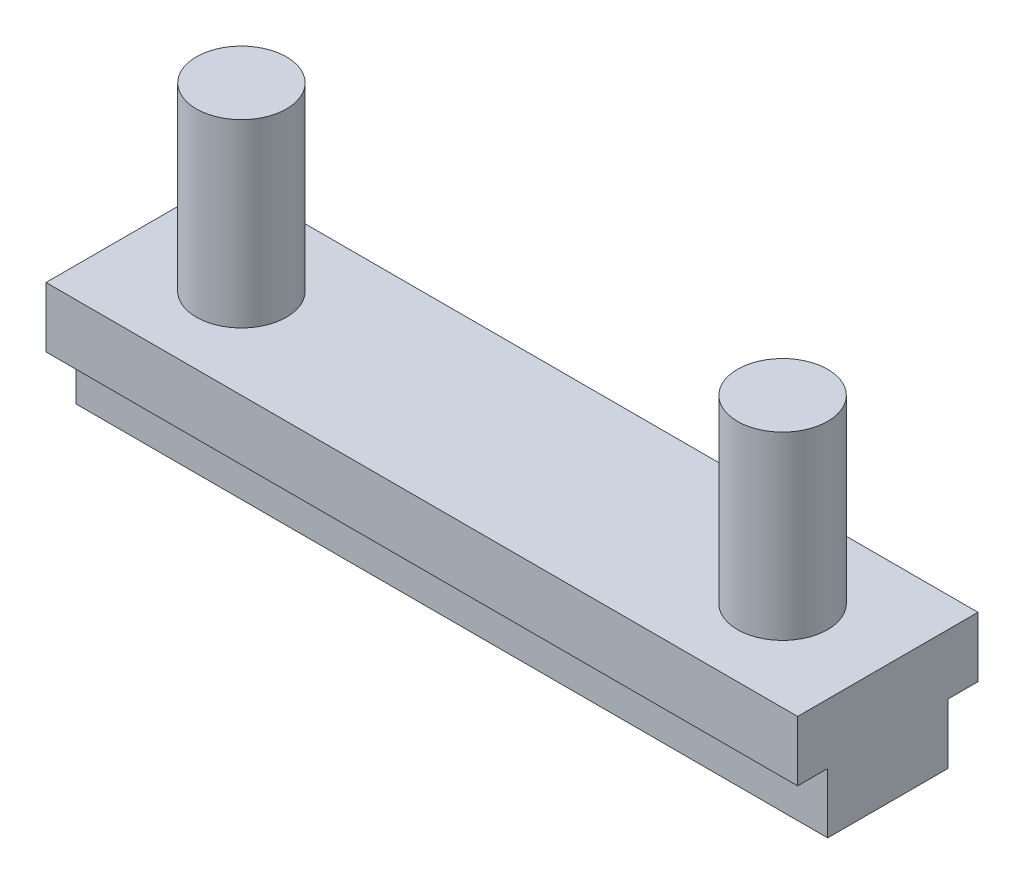
ISO-10303-21;
HEADER;
FILE_DESCRIPTION(('STEP AP214'),'2;1');
FILE_NAME('part.step','',(''),(''),'','','');
FILE_SCHEMA(('AUTOMOTIVE_DESIGN { 1 0 10303 214 1 1 1 1 }'));
ENDSEC;
DATA;
#1=APPLICATION_CONTEXT('core data for automotive mechanical design processes');
#2=APPLICATION_PROTOCOL_DEFINITION('international standard','automotive_design',2000,#1);
#3=PRODUCT_CONTEXT('',#1,'mechanical');
#4=PRODUCT('Part','Part','',(#3));
#5=PRODUCT_RELATED_PRODUCT_CATEGORY('part','',(#4));
#6=PRODUCT_DEFINITION_FORMATION('','',#4);
#7=PRODUCT_DEFINITION_CONTEXT('part definition',#1,'design');
#8=PRODUCT_DEFINITION('design','',#6,#7);
#9=PRODUCT_DEFINITION_SHAPE('','',#8);
#10=(LENGTH_UNIT() NAMED_UNIT(*) SI_UNIT(.MILLI.,.METRE.));
#11=(NAMED_UNIT(*) PLANE_ANGLE_UNIT() SI_UNIT($,.RADIAN.));
#12=(NAMED_UNIT(*) SI_UNIT($,.STERADIAN.) SOLID_ANGLE_UNIT());
#13=UNCERTAINTY_MEASURE_WITH_UNIT(LENGTH_MEASURE(1.E-05),#10,'distance_accuracy_value','');
#14=(GEOMETRIC_REPRESENTATION_CONTEXT(3) GLOBAL_UNCERTAINTY_ASSIGNED_CONTEXT((#13)) GLOBAL_UNIT_ASSIGNED_CONTEXT((#10,
#11,#12)) REPRESENTATION_CONTEXT('',''));
#15=CARTESIAN_POINT('',(0.,0.,0.));
#16=DIRECTION('',(0.,0.,1.));
#17=DIRECTION('',(1.,0.,0.));
#18=AXIS2_PLACEMENT_3D('',#15,#16,#17);
#19=CARTESIAN_POINT('',(0.,0.,0.));
#20=DIRECTION('',(0.,-1.,0.));
#21=DIRECTION('',(0.,0.,-1.));
#22=AXIS2_PLACEMENT_3D('',#19,#20,#21);
#23=PLANE('',#22);
#24=DIRECTION('',(1.,0.,0.));
#25=VECTOR('',#24,1.);
#26=CARTESIAN_POINT('',(-62.5,0.,-10.));
#27=LINE('',#26,#25);
#28=CARTESIAN_POINT('',(-62.5,0.,-10.));
#29=VERTEX_POINT('',#28);
#30=CARTESIAN_POINT('',(62.5,0.,-10.));
#31=VERTEX_POINT('',#30);
#32=EDGE_CURVE('E61',#29,#31,#27,.T.);
#33=ORIENTED_EDGE('',*,*,#32,.F.);
#34=DIRECTION('',(0.,0.,1.));
#35=VECTOR('',#34,1.);
#36=CARTESIAN_POINT('',(-62.5,0.,15.));
#37=LINE('',#36,#35);
#38=CARTESIAN_POINT('',(-62.5,0.,-15.));
#39=VERTEX_POINT('',#38);
#40=EDGE_CURVE('E173',#39,#29,#37,.T.);
#41=ORIENTED_EDGE('',*,*,#40,.F.);
#42=DIRECTION('',(-1.,0.,0.));
#43=VECTOR('',#42,1.);
#44=CARTESIAN_POINT('',(-62.5,0.,-15.));
#45=LINE('',#44,#43);
#46=CARTESIAN_POINT('',(62.5,0.,-15.));
#47=VERTEX_POINT('',#46);
#48=EDGE_CURVE('E169',#47,#39,#45,.T.);
#49=ORIENTED_EDGE('',*,*,#48,.F.);
#50=DIRECTION('',(0.,0.,-1.));
#51=VECTOR('',#50,1.);
#52=CARTESIAN_POINT('',(62.5,0.,15.));
#53=LINE('',#52,#51);
#54=EDGE_CURVE('E66',#31,#47,#53,.T.);
#55=ORIENTED_EDGE('',*,*,#54,.F.);
#56=EDGE_LOOP('',(#33,#41,#49,#55));
#57=FACE_BOUND('',#56,.T.);
#58=ADVANCED_FACE('F45',(#57),#23,.T.);
#59=CARTESIAN_POINT('',(0.,10.,0.));
#60=DIRECTION('',(0.,-1.,0.));
#61=DIRECTION('',(0.,0.,-1.));
#62=AXIS2_PLACEMENT_3D('',#59,#60,#61);
#63=PLANE('',#62);
#64=DIRECTION('',(0.,0.,-1.));
#65=VECTOR('',#64,1.);
#66=CARTESIAN_POINT('',(62.5,10.,15.));
#67=LINE('',#66,#65);
#68=CARTESIAN_POINT('',(62.5,10.,15.));
#69=VERTEX_POINT('',#68);
#70=CARTESIAN_POINT('',(62.5,10.,-15.));
#71=VERTEX_POINT('',#70);
#72=EDGE_CURVE('E152',#69,#71,#67,.T.);
#73=ORIENTED_EDGE('',*,*,#72,.T.);
#74=DIRECTION('',(-1.,0.,0.));
#75=VECTOR('',#74,1.);
#76=CARTESIAN_POINT('',(-62.5,10.,-15.));
#77=LINE('',#76,#75);
#78=CARTESIAN_POINT('',(-62.5,10.,-15.));
#79=VERTEX_POINT('',#78);
#80=EDGE_CURVE('E156',#71,#79,#77,.T.);
#81=ORIENTED_EDGE('',*,*,#80,.T.);
#82=DIRECTION('',(0.,0.,1.));
#83=VECTOR('',#82,1.);
#84=CARTESIAN_POINT('',(-62.5,10.,15.));
#85=LINE('',#84,#83);
#86=CARTESIAN_POINT('',(-62.5,10.,15.));
#87=VERTEX_POINT('',#86);
#88=EDGE_CURVE('E160',#79,#87,#85,.T.);
#89=ORIENTED_EDGE('',*,*,#88,.T.);
#90=DIRECTION('',(1.,0.,0.));
#91=VECTOR('',#90,1.);
#92=CARTESIAN_POINT('',(-62.5,10.,15.));
#93=LINE('',#92,#91);
#94=EDGE_CURVE('E163',#87,#69,#93,.T.);
#95=ORIENTED_EDGE('',*,*,#94,.T.);
#96=EDGE_LOOP('',(#73,#81,#89,#95));
#97=FACE_BOUND('',#96,.T.);
#98=CARTESIAN_POINT('',(-45.,10.,0.));
#99=DIRECTION('',(0.,1.,0.));
#100=DIRECTION('',(0.,0.,1.));
#101=AXIS2_PLACEMENT_3D('',#98,#99,#100);
#102=CIRCLE('',#101,7.5);
#103=CARTESIAN_POINT('',(-45.,10.,7.5));
#104=VERTEX_POINT('',#103);
#105=EDGE_CURVE('E143',#104,#104,#102,.T.);
#106=ORIENTED_EDGE('',*,*,#105,.F.);
#107=EDGE_LOOP('',(#106));
#108=FACE_BOUND('',#107,.T.);
#109=CARTESIAN_POINT('',(45.,10.,0.));
#110=DIRECTION('',(0.,1.,0.));
#111=DIRECTION('',(0.,0.,1.));
#112=AXIS2_PLACEMENT_3D('',#109,#110,#111);
#113=CIRCLE('',#112,7.5);
#114=CARTESIAN_POINT('',(45.,10.,7.5));
#115=VERTEX_POINT('',#114);
#116=EDGE_CURVE('E138',#115,#115,#113,.T.);
#117=ORIENTED_EDGE('',*,*,#116,.F.);
#118=EDGE_LOOP('',(#117));
#119=FACE_BOUND('',#118,.T.);
#120=ADVANCED_FACE('F239',(#97,#108,#119),#63,.F.);
#121=DIRECTION('',(-1.,0.,0.));
#122=VECTOR('',#121,1.);
#123=CARTESIAN_POINT('',(-62.5,0.,10.));
#124=LINE('',#123,#122);
#125=CARTESIAN_POINT('',(62.5,0.,10.));
#126=VERTEX_POINT('',#125);
#127=CARTESIAN_POINT('',(-62.5,0.,10.));
#128=VERTEX_POINT('',#127);
#129=EDGE_CURVE('E206',#126,#128,#124,.T.);
#130=ORIENTED_EDGE('',*,*,#129,.F.);
#131=CARTESIAN_POINT('',(62.5,0.,15.));
#132=VERTEX_POINT('',#131);
#133=EDGE_CURVE('E136',#132,#126,#53,.T.);
#134=ORIENTED_EDGE('',*,*,#133,.F.);
#135=DIRECTION('',(1.,0.,0.));
#136=VECTOR('',#135,1.);
#137=CARTESIAN_POINT('',(-62.5,0.,15.));
#138=LINE('',#137,#136);
#139=CARTESIAN_POINT('',(-62.5,0.,15.));
#140=VERTEX_POINT('',#139);
#141=EDGE_CURVE('E157',#140,#132,#138,.T.);
#142=ORIENTED_EDGE('',*,*,#141,.F.);
#143=EDGE_CURVE('E172',#128,#140,#37,.T.);
#144=ORIENTED_EDGE('',*,*,#143,.F.);
#145=EDGE_LOOP('',(#130,#134,#142,#144));
#146=FACE_BOUND('',#145,.T.);
#147=ADVANCED_FACE('F205',(#146),#23,.T.);
#148=CARTESIAN_POINT('',(62.5,10.,15.));
#149=DIRECTION('',(-1.,0.,0.));
#150=DIRECTION('',(0.,0.,1.));
#151=AXIS2_PLACEMENT_3D('',#148,#149,#150);
#152=PLANE('',#151);
#153=ORIENTED_EDGE('',*,*,#133,.T.);
#154=DIRECTION('',(0.,1.,0.));
#155=VECTOR('',#154,1.);
#156=CARTESIAN_POINT('',(62.5,-10.,10.));
#157=LINE('',#156,#155);
#158=CARTESIAN_POINT('',(62.5,-10.,10.));
#159=VERTEX_POINT('',#158);
#160=EDGE_CURVE('E115',#159,#126,#157,.T.);
#161=ORIENTED_EDGE('',*,*,#160,.F.);
#162=DIRECTION('',(0.,0.,1.));
#163=VECTOR('',#162,1.);
#164=CARTESIAN_POINT('',(62.5,-10.,-10.));
#165=LINE('',#164,#163);
#166=CARTESIAN_POINT('',(62.5,-10.,-10.));
#167=VERTEX_POINT('',#166);
#168=EDGE_CURVE('E122',#167,#159,#165,.T.);
#169=ORIENTED_EDGE('',*,*,#168,.F.);
#170=DIRECTION('',(0.,1.,0.));
#171=VECTOR('',#170,1.);
#172=CARTESIAN_POINT('',(62.5,-10.,-10.));
#173=LINE('',#172,#171);
#174=EDGE_CURVE('E196',#167,#31,#173,.T.);
#175=ORIENTED_EDGE('',*,*,#174,.T.);
#176=ORIENTED_EDGE('',*,*,#54,.T.);
#177=DIRECTION('',(0.,-1.,0.));
#178=VECTOR('',#177,1.);
#179=CARTESIAN_POINT('',(62.5,10.,-15.));
#180=LINE('',#179,#178);
#181=EDGE_CURVE('E11',#71,#47,#180,.T.);
#182=ORIENTED_EDGE('',*,*,#181,.F.);
#183=ORIENTED_EDGE('',*,*,#72,.F.);
#184=DIRECTION('',(0.,-1.,0.));
#185=VECTOR('',#184,1.);
#186=CARTESIAN_POINT('',(62.5,10.,15.));
#187=LINE('',#186,#185);
#188=EDGE_CURVE('E166',#69,#132,#187,.T.);
#189=ORIENTED_EDGE('',*,*,#188,.T.);
#190=EDGE_LOOP('',(#153,#161,#169,#175,#176,#182,#183,#189));
#191=FACE_BOUND('',#190,.T.);
#192=ADVANCED_FACE('F47',(#191),#152,.F.);
#193=CARTESIAN_POINT('',(-62.5,10.,-15.));
#194=DIRECTION('',(0.,0.,1.));
#195=DIRECTION('',(1.,0.,0.));
#196=AXIS2_PLACEMENT_3D('',#193,#194,#195);
#197=PLANE('',#196);
#198=ORIENTED_EDGE('',*,*,#48,.T.);
#199=DIRECTION('',(0.,-1.,0.));
#200=VECTOR('',#199,1.);
#201=CARTESIAN_POINT('',(-62.5,10.,-15.));
#202=LINE('',#201,#200);
#203=EDGE_CURVE('E54',#79,#39,#202,.T.);
#204=ORIENTED_EDGE('',*,*,#203,.F.);
#205=ORIENTED_EDGE('',*,*,#80,.F.);
#206=ORIENTED_EDGE('',*,*,#181,.T.);
#207=EDGE_LOOP('',(#198,#204,#205,#206));
#208=FACE_BOUND('',#207,.T.);
#209=ADVANCED_FACE('F194',(#208),#197,.F.);
#210=CARTESIAN_POINT('',(-62.5,10.,15.));
#211=DIRECTION('',(1.,0.,0.));
#212=DIRECTION('',(0.,0.,-1.));
#213=AXIS2_PLACEMENT_3D('',#210,#211,#212);
#214=PLANE('',#213);
#215=ORIENTED_EDGE('',*,*,#40,.T.);
#216=DIRECTION('',(0.,1.,0.));
#217=VECTOR('',#216,1.);
#218=CARTESIAN_POINT('',(-62.5,-10.,-10.));
#219=LINE('',#218,#217);
#220=CARTESIAN_POINT('',(-62.5,-10.,-10.));
#221=VERTEX_POINT('',#220);
#222=EDGE_CURVE('E145',#221,#29,#219,.T.);
#223=ORIENTED_EDGE('',*,*,#222,.F.);
#224=DIRECTION('',(0.,0.,-1.));
#225=VECTOR('',#224,1.);
#226=CARTESIAN_POINT('',(-62.5,-10.,-10.));
#227=LINE('',#226,#225);
#228=CARTESIAN_POINT('',(-62.5,-10.,10.));
#229=VERTEX_POINT('',#228);
#230=EDGE_CURVE('E121',#229,#221,#227,.T.);
#231=ORIENTED_EDGE('',*,*,#230,.F.);
#232=DIRECTION('',(0.,1.,0.));
#233=VECTOR('',#232,1.);
#234=CARTESIAN_POINT('',(-62.5,-10.,10.));
#235=LINE('',#234,#233);
#236=EDGE_CURVE('E117',#229,#128,#235,.T.);
#237=ORIENTED_EDGE('',*,*,#236,.T.);
#238=ORIENTED_EDGE('',*,*,#143,.T.);
#239=DIRECTION('',(0.,-1.,0.));
#240=VECTOR('',#239,1.);
#241=CARTESIAN_POINT('',(-62.5,10.,15.));
#242=LINE('',#241,#240);
#243=EDGE_CURVE('E180',#87,#140,#242,.T.);
#244=ORIENTED_EDGE('',*,*,#243,.F.);
#245=ORIENTED_EDGE('',*,*,#88,.F.);
#246=ORIENTED_EDGE('',*,*,#203,.T.);
#247=EDGE_LOOP('',(#215,#223,#231,#237,#238,#244,#245,#246));
#248=FACE_BOUND('',#247,.T.);
#249=ADVANCED_FACE('F188',(#248),#214,.F.);
#250=CARTESIAN_POINT('',(-62.5,10.,15.));
#251=DIRECTION('',(0.,0.,-1.));
#252=DIRECTION('',(-1.,0.,0.));
#253=AXIS2_PLACEMENT_3D('',#250,#251,#252);
#254=PLANE('',#253);
#255=ORIENTED_EDGE('',*,*,#141,.T.);
#256=ORIENTED_EDGE('',*,*,#188,.F.);
#257=ORIENTED_EDGE('',*,*,#94,.F.);
#258=ORIENTED_EDGE('',*,*,#243,.T.);
#259=EDGE_LOOP('',(#255,#256,#257,#258));
#260=FACE_BOUND('',#259,.T.);
#261=ADVANCED_FACE('F203',(#260),#254,.F.);
#262=CARTESIAN_POINT('',(0.,-10.,0.));
#263=DIRECTION('',(0.,1.,0.));
#264=DIRECTION('',(0.,0.,1.));
#265=AXIS2_PLACEMENT_3D('',#262,#263,#264);
#266=PLANE('',#265);
#267=ORIENTED_EDGE('',*,*,#168,.T.);
#268=DIRECTION('',(-1.,0.,0.));
#269=VECTOR('',#268,1.);
#270=CARTESIAN_POINT('',(-62.5,-10.,10.));
#271=LINE('',#270,#269);
#272=EDGE_CURVE('E110',#159,#229,#271,.T.);
#273=ORIENTED_EDGE('',*,*,#272,.T.);
#274=ORIENTED_EDGE('',*,*,#230,.T.);
#275=DIRECTION('',(1.,0.,0.));
#276=VECTOR('',#275,1.);
#277=CARTESIAN_POINT('',(-62.5,-10.,-10.));
#278=LINE('',#277,#276);
#279=EDGE_CURVE('E127',#221,#167,#278,.T.);
#280=ORIENTED_EDGE('',*,*,#279,.T.);
#281=EDGE_LOOP('',(#267,#273,#274,#280));
#282=FACE_BOUND('',#281,.T.);
#283=ADVANCED_FACE('F125',(#282),#266,.F.);
#284=CARTESIAN_POINT('',(-62.5,-10.,-10.));
#285=DIRECTION('',(0.,0.,1.));
#286=DIRECTION('',(1.,0.,0.));
#287=AXIS2_PLACEMENT_3D('',#284,#285,#286);
#288=PLANE('',#287);
#289=ORIENTED_EDGE('',*,*,#32,.T.);
#290=ORIENTED_EDGE('',*,*,#174,.F.);
#291=ORIENTED_EDGE('',*,*,#279,.F.);
#292=ORIENTED_EDGE('',*,*,#222,.T.);
#293=EDGE_LOOP('',(#289,#290,#291,#292));
#294=FACE_BOUND('',#293,.T.);
#295=ADVANCED_FACE('F222',(#294),#288,.F.);
#296=CARTESIAN_POINT('',(-62.5,-10.,10.));
#297=DIRECTION('',(0.,0.,-1.));
#298=DIRECTION('',(-1.,0.,0.));
#299=AXIS2_PLACEMENT_3D('',#296,#297,#298);
#300=PLANE('',#299);
#301=ORIENTED_EDGE('',*,*,#129,.T.);
#302=ORIENTED_EDGE('',*,*,#236,.F.);
#303=ORIENTED_EDGE('',*,*,#272,.F.);
#304=ORIENTED_EDGE('',*,*,#160,.T.);
#305=EDGE_LOOP('',(#301,#302,#303,#304));
#306=FACE_BOUND('',#305,.T.);
#307=ADVANCED_FACE('F113',(#306),#300,.F.);
#308=CARTESIAN_POINT('',(45.,40.,0.));
#309=DIRECTION('',(0.,-1.,0.));
#310=DIRECTION('',(0.,0.,-1.));
#311=AXIS2_PLACEMENT_3D('',#308,#309,#310);
#312=CYLINDRICAL_SURFACE('',#311,7.5);
#313=CARTESIAN_POINT('',(45.,40.,0.));
#314=DIRECTION('',(0.,1.,0.));
#315=DIRECTION('',(0.,0.,1.));
#316=AXIS2_PLACEMENT_3D('',#313,#314,#315);
#317=CIRCLE('',#316,7.5);
#318=CARTESIAN_POINT('',(45.,40.,7.5));
#319=VERTEX_POINT('',#318);
#320=EDGE_CURVE('E208',#319,#319,#317,.T.);
#321=ORIENTED_EDGE('',*,*,#320,.F.);
#322=EDGE_LOOP('',(#321));
#323=FACE_BOUND('',#322,.T.);
#324=ORIENTED_EDGE('',*,*,#116,.T.);
#325=EDGE_LOOP('',(#324));
#326=FACE_BOUND('',#325,.T.);
#327=ADVANCED_FACE('F246',(#323,#326),#312,.T.);
#328=CARTESIAN_POINT('',(45.,40.,0.));
#329=DIRECTION('',(0.,1.,0.));
#330=DIRECTION('',(0.,0.,1.));
#331=AXIS2_PLACEMENT_3D('',#328,#329,#330);
#332=PLANE('',#331);
#333=ORIENTED_EDGE('',*,*,#320,.T.);
#334=EDGE_LOOP('',(#333));
#335=FACE_BOUND('',#334,.T.);
#336=ADVANCED_FACE('F235',(#335),#332,.T.);
#337=CARTESIAN_POINT('',(-45.,40.,0.));
#338=DIRECTION('',(0.,-1.,0.));
#339=DIRECTION('',(0.,0.,-1.));
#340=AXIS2_PLACEMENT_3D('',#337,#338,#339);
#341=CYLINDRICAL_SURFACE('',#340,7.5);
#342=CARTESIAN_POINT('',(-45.,40.,0.));
#343=DIRECTION('',(0.,1.,0.));
#344=DIRECTION('',(0.,0.,1.));
#345=AXIS2_PLACEMENT_3D('',#342,#343,#344);
#346=CIRCLE('',#345,7.5);
#347=CARTESIAN_POINT('',(-45.,40.,7.5));
#348=VERTEX_POINT('',#347);
#349=EDGE_CURVE('E214',#348,#348,#346,.T.);
#350=ORIENTED_EDGE('',*,*,#349,.F.);
#351=EDGE_LOOP('',(#350));
#352=FACE_BOUND('',#351,.T.);
#353=ORIENTED_EDGE('',*,*,#105,.T.);
#354=EDGE_LOOP('',(#353));
#355=FACE_BOUND('',#354,.T.);
#356=ADVANCED_FACE('F232',(#352,#355),#341,.T.);
#357=CARTESIAN_POINT('',(-45.,40.,0.));
#358=DIRECTION('',(0.,1.,0.));
#359=DIRECTION('',(0.,0.,1.));
#360=AXIS2_PLACEMENT_3D('',#357,#358,#359);
#361=PLANE('',#360);
#362=ORIENTED_EDGE('',*,*,#349,.T.);
#363=EDGE_LOOP('',(#362));
#364=FACE_BOUND('',#363,.T.);
#365=ADVANCED_FACE('F230',(#364),#361,.T.);
#366=CLOSED_SHELL('',(#58,#120,#147,#192,#209,#249,#261,#283,#295,#307,#327,#336,#356,#365));
#367=MANIFOLD_SOLID_BREP('B2',#366);
#368=ADVANCED_BREP_SHAPE_REPRESENTATION('',(#18,#367),#14);
#369=SHAPE_DEFINITION_REPRESENTATION(#9,#368);
ENDSEC;
END-ISO-10303-21;
